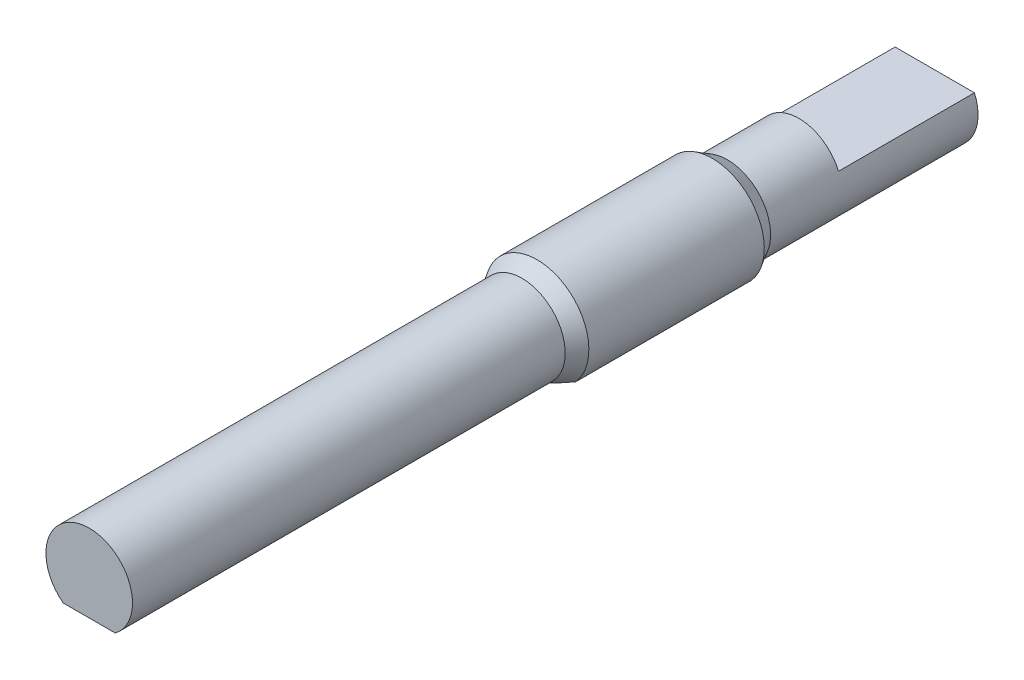
ISO-10303-21;
HEADER;
FILE_DESCRIPTION(('STEP AP214'),'2;1');
FILE_NAME('part.step','',(''),(''),'','','');
FILE_SCHEMA(('AUTOMOTIVE_DESIGN { 1 0 10303 214 1 1 1 1 }'));
ENDSEC;
DATA;
#1=APPLICATION_CONTEXT('core data for automotive mechanical design processes');
#2=APPLICATION_PROTOCOL_DEFINITION('international standard','automotive_design',2000,#1);
#3=PRODUCT_CONTEXT('',#1,'mechanical');
#4=PRODUCT('Part','Part','',(#3));
#5=PRODUCT_RELATED_PRODUCT_CATEGORY('part','',(#4));
#6=PRODUCT_DEFINITION_FORMATION('','',#4);
#7=PRODUCT_DEFINITION_CONTEXT('part definition',#1,'design');
#8=PRODUCT_DEFINITION('design','',#6,#7);
#9=PRODUCT_DEFINITION_SHAPE('','',#8);
#10=(LENGTH_UNIT() NAMED_UNIT(*) SI_UNIT(.MILLI.,.METRE.));
#11=(NAMED_UNIT(*) PLANE_ANGLE_UNIT() SI_UNIT($,.RADIAN.));
#12=(NAMED_UNIT(*) SI_UNIT($,.STERADIAN.) SOLID_ANGLE_UNIT());
#13=UNCERTAINTY_MEASURE_WITH_UNIT(LENGTH_MEASURE(1.E-05),#10,'distance_accuracy_value','');
#14=(GEOMETRIC_REPRESENTATION_CONTEXT(3) GLOBAL_UNCERTAINTY_ASSIGNED_CONTEXT((#13)) GLOBAL_UNIT_ASSIGNED_CONTEXT((#10,
#11,#12)) REPRESENTATION_CONTEXT('',''));
#15=CARTESIAN_POINT('',(0.,0.,0.));
#16=DIRECTION('',(0.,0.,1.));
#17=DIRECTION('',(1.,0.,0.));
#18=AXIS2_PLACEMENT_3D('',#15,#16,#17);
#19=CARTESIAN_POINT('',(0.,0.,25.));
#20=DIRECTION('',(0.,0.,-1.));
#21=DIRECTION('',(-1.,0.,0.));
#22=AXIS2_PLACEMENT_3D('',#19,#20,#21);
#23=CYLINDRICAL_SURFACE('',#22,2.5);
#24=CARTESIAN_POINT('',(0.,0.,25.));
#25=DIRECTION('',(0.,0.,1.));
#26=DIRECTION('',(1.,0.,0.));
#27=AXIS2_PLACEMENT_3D('',#24,#25,#26);
#28=CIRCLE('',#27,2.5);
#29=CARTESIAN_POINT('',(1.5,-2.,25.));
#30=VERTEX_POINT('',#29);
#31=CARTESIAN_POINT('',(-1.5,-2.,25.));
#32=VERTEX_POINT('',#31);
#33=EDGE_CURVE('E208',#30,#32,#28,.T.);
#34=ORIENTED_EDGE('',*,*,#33,.F.);
#35=DIRECTION('',(0.,0.,-1.));
#36=VECTOR('',#35,1.);
#37=CARTESIAN_POINT('',(1.5,-2.,25.));
#38=LINE('',#37,#36);
#39=CARTESIAN_POINT('',(1.5,-2.,0.));
#40=VERTEX_POINT('',#39);
#41=EDGE_CURVE('E218',#30,#40,#38,.T.);
#42=ORIENTED_EDGE('',*,*,#41,.T.);
#43=CARTESIAN_POINT('',(0.,0.,0.));
#44=DIRECTION('',(0.,0.,1.));
#45=DIRECTION('',(1.,0.,0.));
#46=AXIS2_PLACEMENT_3D('',#43,#44,#45);
#47=CIRCLE('',#46,2.5);
#48=CARTESIAN_POINT('',(-1.5,-2.,0.));
#49=VERTEX_POINT('',#48);
#50=EDGE_CURVE('E207',#40,#49,#47,.T.);
#51=ORIENTED_EDGE('',*,*,#50,.T.);
#52=DIRECTION('',(0.,0.,-1.));
#53=VECTOR('',#52,1.);
#54=CARTESIAN_POINT('',(-1.5,-2.,25.));
#55=LINE('',#54,#53);
#56=EDGE_CURVE('E63',#49,#32,#55,.F.);
#57=ORIENTED_EDGE('',*,*,#56,.T.);
#58=EDGE_LOOP('',(#34,#42,#51,#57));
#59=FACE_BOUND('',#58,.T.);
#60=ADVANCED_FACE('F40',(#59),#23,.T.);
#61=CARTESIAN_POINT('',(0.,0.,25.));
#62=DIRECTION('',(0.,0.,1.));
#63=DIRECTION('',(1.,0.,0.));
#64=AXIS2_PLACEMENT_3D('',#61,#62,#63);
#65=PLANE('',#64);
#66=DIRECTION('',(-1.,0.,0.));
#67=VECTOR('',#66,1.);
#68=CARTESIAN_POINT('',(0.,-2.,25.));
#69=LINE('',#68,#67);
#70=EDGE_CURVE('E56',#30,#32,#69,.T.);
#71=ORIENTED_EDGE('',*,*,#70,.F.);
#72=ORIENTED_EDGE('',*,*,#33,.T.);
#73=EDGE_LOOP('',(#71,#72));
#74=FACE_BOUND('',#73,.T.);
#75=ADVANCED_FACE('F171',(#74),#65,.T.);
#76=CARTESIAN_POINT('',(0.,0.,-11.));
#77=DIRECTION('',(0.,0.,1.));
#78=DIRECTION('',(1.,0.,0.));
#79=AXIS2_PLACEMENT_3D('',#76,#77,#78);
#80=CYLINDRICAL_SURFACE('',#79,3.);
#81=CARTESIAN_POINT('',(0.,0.,-11.));
#82=DIRECTION('',(0.,0.,-1.));
#83=DIRECTION('',(-1.,0.,0.));
#84=AXIS2_PLACEMENT_3D('',#81,#82,#83);
#85=CIRCLE('',#84,3.);
#86=CARTESIAN_POINT('',(-2.23606797749979,-2.,-11.));
#87=VERTEX_POINT('',#86);
#88=CARTESIAN_POINT('',(2.23606797749979,-2.,-11.));
#89=VERTEX_POINT('',#88);
#90=EDGE_CURVE('E204',#87,#89,#85,.T.);
#91=ORIENTED_EDGE('',*,*,#90,.F.);
#92=DIRECTION('',(0.,0.,1.));
#93=VECTOR('',#92,1.);
#94=CARTESIAN_POINT('',(-2.23606797749979,-2.,-11.));
#95=LINE('',#94,#93);
#96=CARTESIAN_POINT('',(-2.23606797749979,-2.,-0.866025403784439));
#97=VERTEX_POINT('',#96);
#98=EDGE_CURVE('E158',#87,#97,#95,.T.);
#99=ORIENTED_EDGE('',*,*,#98,.T.);
#100=CARTESIAN_POINT('',(0.,0.,-0.866025403784439));
#101=DIRECTION('',(0.,0.,-1.));
#102=DIRECTION('',(-1.,0.,0.));
#103=AXIS2_PLACEMENT_3D('',#100,#101,#102);
#104=CIRCLE('',#103,3.);
#105=CARTESIAN_POINT('',(2.23606797749979,-2.,-0.866025403784439));
#106=VERTEX_POINT('',#105);
#107=EDGE_CURVE('E210',#97,#106,#104,.T.);
#108=ORIENTED_EDGE('',*,*,#107,.T.);
#109=DIRECTION('',(0.,0.,1.));
#110=VECTOR('',#109,1.);
#111=CARTESIAN_POINT('',(2.23606797749979,-2.,-11.));
#112=LINE('',#111,#110);
#113=EDGE_CURVE('E142',#106,#89,#112,.F.);
#114=ORIENTED_EDGE('',*,*,#113,.T.);
#115=EDGE_LOOP('',(#91,#99,#108,#114));
#116=FACE_BOUND('',#115,.T.);
#117=ADVANCED_FACE('F167',(#116),#80,.T.);
#118=CARTESIAN_POINT('',(0.,0.,-0.866025403784439));
#119=DIRECTION('',(0.,0.,-1.));
#120=DIRECTION('',(-1.,0.,0.));
#121=AXIS2_PLACEMENT_3D('',#118,#119,#120);
#122=CONICAL_SURFACE('',#121,3.,0.523598775598297);
#123=CARTESIAN_POINT('',(2.23661016595739,-2.,-0.866725403784439));
#124=CARTESIAN_POINT('',(2.18726664014089,-2.,-0.803033071174665));
#125=CARTESIAN_POINT('',(2.13748259507712,-2.,-0.739676346682983));
#126=CARTESIAN_POINT('',(2.03683184790524,-2.,-0.613795352713225));
#127=CARTESIAN_POINT('',(1.98596479297575,-2.,-0.551271365649455));
#128=CARTESIAN_POINT('',(1.88228724074045,-2.,-0.426426706496489));
#129=CARTESIAN_POINT('',(1.82945981731535,-2.,-0.364120043102219));
#130=CARTESIAN_POINT('',(1.72227192526655,-2.,-0.24085096266649));
#131=CARTESIAN_POINT('',(1.66791167428164,-2.,-0.179888356957202));
#132=CARTESIAN_POINT('',(1.55335778674456,-2.,-0.0553452759837598));
#133=CARTESIAN_POINT('',(1.49302567658785,-2.,0.00810850221818952));
#134=CARTESIAN_POINT('',(1.36972792075992,-2.,0.132399385515604));
#135=CARTESIAN_POINT('',(1.30676282508385,-2.,0.193237031753401));
#136=CARTESIAN_POINT('',(1.17788872353185,-2.,0.311008191068564));
#137=CARTESIAN_POINT('',(1.11199770678652,-2.,0.36796124119291));
#138=CARTESIAN_POINT('',(0.976199242747053,-2.,0.476814597641537));
#139=CARTESIAN_POINT('',(0.906296448556987,-2.,0.528720576774447));
#140=CARTESIAN_POINT('',(0.799940004250271,-2.,0.599606925092459));
#141=CARTESIAN_POINT('',(0.765399801139247,-2.,0.621454325880099));
#142=CARTESIAN_POINT('',(0.695145832543396,-2.,0.663192577265789));
#143=CARTESIAN_POINT('',(0.659431650775473,-2.,0.683082723632428));
#144=CARTESIAN_POINT('',(0.550936362503915,-2.,0.738975543798395));
#145=CARTESIAN_POINT('',(0.476293869608862,-2.,0.771552011378186));
#146=CARTESIAN_POINT('',(0.333968670143521,-2.,0.819813770183789));
#147=CARTESIAN_POINT('',(0.266908219474679,-2.,0.837293614487771));
#148=CARTESIAN_POINT('',(0.130773906542163,-2.,0.860600687840221));
#149=CARTESIAN_POINT('',(0.061702213260861,-2.,0.866440030200273));
#150=CARTESIAN_POINT('',(-0.0764939692106354,-2.,0.865563411175417));
#151=CARTESIAN_POINT('',(-0.14561830035995,-2.,0.858823040930376));
#152=CARTESIAN_POINT('',(-0.281716005411692,-2.,0.83380272817737));
#153=CARTESIAN_POINT('',(-0.348687086085616,-2.,0.815510884906201));
#154=CARTESIAN_POINT('',(-0.510669248764108,-2.,0.758657980617055));
#155=CARTESIAN_POINT('',(-0.603714349109279,-2.,0.714582506458467));
#156=CARTESIAN_POINT('',(-0.737868578718455,-2.,0.638527663157651));
#157=CARTESIAN_POINT('',(-0.781913239193631,-2.,0.611340207373083));
#158=CARTESIAN_POINT('',(-0.868245506414882,-2.,0.554310997854809));
#159=CARTESIAN_POINT('',(-0.91053375229659,-2.,0.524470222265757));
#160=CARTESIAN_POINT('',(-1.0168179117519,-2.,0.445354455641794));
#161=CARTESIAN_POINT('',(-1.07968100681679,-2.,0.394569382325353));
#162=CARTESIAN_POINT('',(-1.20228613968727,-2.,0.289336984676686));
#163=CARTESIAN_POINT('',(-1.26202623193758,-2.,0.23488742464741));
#164=CARTESIAN_POINT('',(-1.3791373698903,-2.,0.123123816195552));
#165=CARTESIAN_POINT('',(-1.43649962401801,-2.,0.065800616439067));
#166=CARTESIAN_POINT('',(-1.54912012559803,-2.,-0.0508791842052778));
#167=CARTESIAN_POINT('',(-1.60437810028153,-2.,-0.110236046826562));
#168=CARTESIAN_POINT('',(-1.70957267620015,-2.,-0.226553079322438));
#169=CARTESIAN_POINT('',(-1.75962002274053,-2.,-0.283413531016207));
#170=CARTESIAN_POINT('',(-1.85844294656092,-2.,-0.39823475061407));
#171=CARTESIAN_POINT('',(-1.90721841636146,-2.,-0.456195610797169));
#172=CARTESIAN_POINT('',(-2.00328289737179,-2.,-0.572516314441755));
#173=CARTESIAN_POINT('',(-2.05058095900981,-2.,-0.630868704832463));
#174=CARTESIAN_POINT('',(-2.14425068995618,-2.,-0.748291466091099));
#175=CARTESIAN_POINT('',(-2.19062256602914,-2.,-0.807361671866581));
#176=CARTESIAN_POINT('',(-2.23661016595739,-2.,-0.866725403784438));
#177=B_SPLINE_CURVE_WITH_KNOTS('',3,(#123,#124,#125,#126,#127,#128,#129,#130,#131,#132,#133,
#134,#135,#136,#137,#138,#139,#140,#141,#142,#143,#144,#145,#146,#147,#148,#149,#150,#151,#152,
#153,#154,#155,#156,#157,#158,#159,#160,#161,#162,#163,#164,#165,#166,#167,#168,#169,#170,#171,
#172,#173,#174,#175,#176),.UNSPECIFIED.,.F.,.F.,(4,2,2,2,2,2,2,2,2,2,2,2,2,2,2,2,2,2,2,2,2,2,2,
2,2,2,4),(0.,0.241714228825522,0.483508445785132,0.728550092917328,0.97355712124028,
1.23617094608527,1.49873018582213,1.75985308417518,2.02067900803402,2.14322999413358,
2.26582491477964,2.50917120104289,2.71622506224583,2.92306334683918,3.13030338436133,
3.33775727747857,3.64476067885647,3.79999330392009,3.95516893797713,4.19740907992852,
4.43979837593437,4.68301583098036,4.92626470669405,5.15348865307162,5.38073173910076,
5.60606401515084,5.8313454119841),.UNSPECIFIED.);
#178=EDGE_CURVE('E157',#106,#40,#177,.T.);
#179=ORIENTED_EDGE('',*,*,#178,.F.);
#180=ORIENTED_EDGE('',*,*,#107,.F.);
#181=EDGE_CURVE('E150',#49,#97,#177,.T.);
#182=ORIENTED_EDGE('',*,*,#181,.F.);
#183=ORIENTED_EDGE('',*,*,#50,.F.);
#184=EDGE_LOOP('',(#179,#180,#182,#183));
#185=FACE_BOUND('',#184,.T.);
#186=ADVANCED_FACE('F161',(#185),#122,.T.);
#187=CARTESIAN_POINT('',(0.,0.,-16.));
#188=DIRECTION('',(0.,0.,1.));
#189=DIRECTION('',(1.,0.,0.));
#190=AXIS2_PLACEMENT_3D('',#187,#188,#189);
#191=CYLINDRICAL_SURFACE('',#190,2.5);
#192=CARTESIAN_POINT('',(0.,0.,-23.85));
#193=DIRECTION('',(0.,0.,-1.));
#194=DIRECTION('',(-1.,0.,0.));
#195=AXIS2_PLACEMENT_3D('',#192,#193,#194);
#196=CIRCLE('',#195,2.5);
#197=CARTESIAN_POINT('',(-1.5,-2.,-23.85));
#198=VERTEX_POINT('',#197);
#199=CARTESIAN_POINT('',(-2.29128784747792,1.,-23.85));
#200=VERTEX_POINT('',#199);
#201=EDGE_CURVE('E116',#198,#200,#196,.T.);
#202=ORIENTED_EDGE('',*,*,#201,.F.);
#203=DIRECTION('',(0.,0.,1.));
#204=VECTOR('',#203,1.);
#205=CARTESIAN_POINT('',(-1.5,-2.,-16.));
#206=LINE('',#205,#204);
#207=CARTESIAN_POINT('',(-1.5,-2.,-11.8660254037844));
#208=VERTEX_POINT('',#207);
#209=EDGE_CURVE('E125',#198,#208,#206,.T.);
#210=ORIENTED_EDGE('',*,*,#209,.T.);
#211=CARTESIAN_POINT('',(0.,0.,-11.8660254037844));
#212=DIRECTION('',(0.,0.,-1.));
#213=DIRECTION('',(-1.,0.,0.));
#214=AXIS2_PLACEMENT_3D('',#211,#212,#213);
#215=CIRCLE('',#214,2.5);
#216=CARTESIAN_POINT('',(1.5,-2.,-11.8660254037844));
#217=VERTEX_POINT('',#216);
#218=EDGE_CURVE('E50',#208,#217,#215,.T.);
#219=ORIENTED_EDGE('',*,*,#218,.T.);
#220=DIRECTION('',(0.,0.,1.));
#221=VECTOR('',#220,1.);
#222=CARTESIAN_POINT('',(1.5,-2.,-16.));
#223=LINE('',#222,#221);
#224=CARTESIAN_POINT('',(1.5,-2.,-23.85));
#225=VERTEX_POINT('',#224);
#226=EDGE_CURVE('E120',#217,#225,#223,.F.);
#227=ORIENTED_EDGE('',*,*,#226,.T.);
#228=CARTESIAN_POINT('',(2.29128784747792,1.,-23.85));
#229=VERTEX_POINT('',#228);
#230=EDGE_CURVE('E107',#229,#225,#196,.T.);
#231=ORIENTED_EDGE('',*,*,#230,.F.);
#232=DIRECTION('',(0.,0.,1.));
#233=VECTOR('',#232,1.);
#234=CARTESIAN_POINT('',(2.29128784747792,1.,-23.85));
#235=LINE('',#234,#233);
#236=CARTESIAN_POINT('',(2.29128784747792,1.,-16.));
#237=VERTEX_POINT('',#236);
#238=EDGE_CURVE('E193',#229,#237,#235,.T.);
#239=ORIENTED_EDGE('',*,*,#238,.T.);
#240=CARTESIAN_POINT('',(0.,0.,-16.));
#241=DIRECTION('',(0.,0.,-1.));
#242=DIRECTION('',(-1.,0.,0.));
#243=AXIS2_PLACEMENT_3D('',#240,#241,#242);
#244=CIRCLE('',#243,2.5);
#245=CARTESIAN_POINT('',(-2.29128784747792,1.,-16.));
#246=VERTEX_POINT('',#245);
#247=EDGE_CURVE('E198',#246,#237,#244,.T.);
#248=ORIENTED_EDGE('',*,*,#247,.F.);
#249=DIRECTION('',(0.,0.,1.));
#250=VECTOR('',#249,1.);
#251=CARTESIAN_POINT('',(-2.29128784747792,1.,-23.85));
#252=LINE('',#251,#250);
#253=EDGE_CURVE('E195',#200,#246,#252,.T.);
#254=ORIENTED_EDGE('',*,*,#253,.F.);
#255=EDGE_LOOP('',(#202,#210,#219,#227,#231,#239,#248,#254));
#256=FACE_BOUND('',#255,.T.);
#257=ADVANCED_FACE('F121',(#256),#191,.T.);
#258=CARTESIAN_POINT('',(0.,0.,-16.));
#259=DIRECTION('',(0.,0.,-1.));
#260=DIRECTION('',(-1.,0.,0.));
#261=AXIS2_PLACEMENT_3D('',#258,#259,#260);
#262=PLANE('',#261);
#263=DIRECTION('',(1.,0.,0.));
#264=VECTOR('',#263,1.);
#265=CARTESIAN_POINT('',(2.29128784747792,1.,-16.));
#266=LINE('',#265,#264);
#267=EDGE_CURVE('E192',#246,#237,#266,.T.);
#268=ORIENTED_EDGE('',*,*,#267,.F.);
#269=ORIENTED_EDGE('',*,*,#247,.T.);
#270=EDGE_LOOP('',(#268,#269));
#271=FACE_BOUND('',#270,.T.);
#272=ADVANCED_FACE('F179',(#271),#262,.T.);
#273=CARTESIAN_POINT('',(0.,0.,-11.8660254037844));
#274=DIRECTION('',(0.,0.,1.));
#275=DIRECTION('',(1.,0.,0.));
#276=AXIS2_PLACEMENT_3D('',#273,#274,#275);
#277=CONICAL_SURFACE('',#276,2.5,0.523598775598294);
#278=ORIENTED_EDGE('',*,*,#90,.T.);
#279=CARTESIAN_POINT('',(2.23661016595739,-2.,-10.9993));
#280=CARTESIAN_POINT('',(2.18726664014089,-2.,-11.0629923326098));
#281=CARTESIAN_POINT('',(2.13748259507712,-2.,-11.1263490571015));
#282=CARTESIAN_POINT('',(2.03683184790524,-2.,-11.2522300510712));
#283=CARTESIAN_POINT('',(1.98596479297575,-2.,-11.314754038135));
#284=CARTESIAN_POINT('',(1.88228724074045,-2.,-11.4395986972879));
#285=CARTESIAN_POINT('',(1.82945981731535,-2.,-11.5019053606822));
#286=CARTESIAN_POINT('',(1.72227192526655,-2.,-11.6251744411179));
#287=CARTESIAN_POINT('',(1.66791167428164,-2.,-11.6861370468272));
#288=CARTESIAN_POINT('',(1.55335778674456,-2.,-11.8106801278007));
#289=CARTESIAN_POINT('',(1.49302567658785,-2.,-11.8741339060026));
#290=CARTESIAN_POINT('',(1.36972792075992,-2.,-11.9984247893));
#291=CARTESIAN_POINT('',(1.30676282508385,-2.,-12.0592624355378));
#292=CARTESIAN_POINT('',(1.17788872353185,-2.,-12.177033594853));
#293=CARTESIAN_POINT('',(1.11199770678652,-2.,-12.2339866449774));
#294=CARTESIAN_POINT('',(0.976199242747056,-2.,-12.342840001426));
#295=CARTESIAN_POINT('',(0.90629644855699,-2.,-12.3947459805589));
#296=CARTESIAN_POINT('',(0.799940004250274,-2.,-12.4656323288769));
#297=CARTESIAN_POINT('',(0.765399801139251,-2.,-12.4874797296645));
#298=CARTESIAN_POINT('',(0.6951458325434,-2.,-12.5292179810502));
#299=CARTESIAN_POINT('',(0.659431650775478,-2.,-12.5491081274169));
#300=CARTESIAN_POINT('',(0.550936362503921,-2.,-12.6050009475828));
#301=CARTESIAN_POINT('',(0.476293869608867,-2.,-12.6375774151626));
#302=CARTESIAN_POINT('',(0.333968670143527,-2.,-12.6858391739682));
#303=CARTESIAN_POINT('',(0.266908219474685,-2.,-12.7033190182722));
#304=CARTESIAN_POINT('',(0.13077390654217,-2.,-12.7266260916247));
#305=CARTESIAN_POINT('',(0.0617022132608684,-2.,-12.7324654339847));
#306=CARTESIAN_POINT('',(-0.0764939692106276,-2.,-12.7315888149599));
#307=CARTESIAN_POINT('',(-0.145618300359942,-2.,-12.7248484447148));
#308=CARTESIAN_POINT('',(-0.281716005411684,-2.,-12.6998281319618));
#309=CARTESIAN_POINT('',(-0.348687086085608,-2.,-12.6815362886907));
#310=CARTESIAN_POINT('',(-0.5106692487641,-2.,-12.6246833844015));
#311=CARTESIAN_POINT('',(-0.60371434910927,-2.,-12.5806079102429));
#312=CARTESIAN_POINT('',(-0.737868578718444,-2.,-12.5045530669421));
#313=CARTESIAN_POINT('',(-0.781913239193619,-2.,-12.4773656111575));
#314=CARTESIAN_POINT('',(-0.868245506414868,-2.,-12.4203364016393));
#315=CARTESIAN_POINT('',(-0.910533752296576,-2.,-12.3904956260502));
#316=CARTESIAN_POINT('',(-1.01681791175189,-2.,-12.3113798594262));
#317=CARTESIAN_POINT('',(-1.07968100681678,-2.,-12.2605947861098));
#318=CARTESIAN_POINT('',(-1.20228613968726,-2.,-12.1553623884611));
#319=CARTESIAN_POINT('',(-1.26202623193757,-2.,-12.1009128284319));
#320=CARTESIAN_POINT('',(-1.37913736989029,-2.,-11.98914921998));
#321=CARTESIAN_POINT('',(-1.436499624018,-2.,-11.9318260202235));
#322=CARTESIAN_POINT('',(-1.54912012559802,-2.,-11.8151462195792));
#323=CARTESIAN_POINT('',(-1.60437810028152,-2.,-11.7557893569579));
#324=CARTESIAN_POINT('',(-1.70957267620015,-2.,-11.639472324462));
#325=CARTESIAN_POINT('',(-1.75962002274053,-2.,-11.5826118727682));
#326=CARTESIAN_POINT('',(-1.85844294656091,-2.,-11.4677906531704));
#327=CARTESIAN_POINT('',(-1.90721841636146,-2.,-11.4098297929873));
#328=CARTESIAN_POINT('',(-2.00328289737179,-2.,-11.2935090893427));
#329=CARTESIAN_POINT('',(-2.05058095900981,-2.,-11.235156698952));
#330=CARTESIAN_POINT('',(-2.14425068995618,-2.,-11.1177339376933));
#331=CARTESIAN_POINT('',(-2.19062256602914,-2.,-11.0586637319179));
#332=CARTESIAN_POINT('',(-2.23661016595739,-2.,-10.9993));
#333=B_SPLINE_CURVE_WITH_KNOTS('',3,(#279,#280,#281,#282,#283,#284,#285,#286,#287,#288,#289,
#290,#291,#292,#293,#294,#295,#296,#297,#298,#299,#300,#301,#302,#303,#304,#305,#306,#307,#308,
#309,#310,#311,#312,#313,#314,#315,#316,#317,#318,#319,#320,#321,#322,#323,#324,#325,#326,#327,
#328,#329,#330,#331,#332),.UNSPECIFIED.,.F.,.F.,(4,2,2,2,2,2,2,2,2,2,2,2,2,2,2,2,2,2,2,2,2,2,2,
2,2,2,4),(0.,0.241714228825522,0.483508445785131,0.728550092917327,0.973557121240281,
1.23617094608527,1.49873018582213,1.75985308417519,2.02067900803403,2.14322999413358,
2.26582491477964,2.50917120104289,2.71622506224583,2.92306334683918,3.13030338436133,
3.33775727747857,3.64476067885647,3.79999330392008,3.95516893797712,4.19740907992851,
4.43979837593437,4.68301583098036,4.92626470669406,5.15348865307163,5.38073173910077,
5.60606401515085,5.83134541198411),.UNSPECIFIED.);
#334=EDGE_CURVE('E134',#89,#217,#333,.T.);
#335=ORIENTED_EDGE('',*,*,#334,.T.);
#336=ORIENTED_EDGE('',*,*,#218,.F.);
#337=EDGE_CURVE('E132',#208,#87,#333,.T.);
#338=ORIENTED_EDGE('',*,*,#337,.T.);
#339=EDGE_LOOP('',(#278,#335,#336,#338));
#340=FACE_BOUND('',#339,.T.);
#341=ADVANCED_FACE('F43',(#340),#277,.T.);
#342=CARTESIAN_POINT('',(2.29128784747792,1.,-23.85));
#343=DIRECTION('',(0.,-1.,0.));
#344=DIRECTION('',(0.,0.,-1.));
#345=AXIS2_PLACEMENT_3D('',#342,#343,#344);
#346=PLANE('',#345);
#347=ORIENTED_EDGE('',*,*,#267,.T.);
#348=ORIENTED_EDGE('',*,*,#238,.F.);
#349=DIRECTION('',(1.,0.,0.));
#350=VECTOR('',#349,1.);
#351=CARTESIAN_POINT('',(2.29128784747792,1.,-23.85));
#352=LINE('',#351,#350);
#353=EDGE_CURVE('E112',#200,#229,#352,.T.);
#354=ORIENTED_EDGE('',*,*,#353,.F.);
#355=ORIENTED_EDGE('',*,*,#253,.T.);
#356=EDGE_LOOP('',(#347,#348,#354,#355));
#357=FACE_BOUND('',#356,.T.);
#358=ADVANCED_FACE('F182',(#357),#346,.F.);
#359=CARTESIAN_POINT('',(0.,0.,-23.85));
#360=DIRECTION('',(0.,0.,-1.));
#361=DIRECTION('',(-1.,0.,0.));
#362=AXIS2_PLACEMENT_3D('',#359,#360,#361);
#363=PLANE('',#362);
#364=DIRECTION('',(1.,0.,0.));
#365=VECTOR('',#364,1.);
#366=CARTESIAN_POINT('',(0.,-2.,-23.85));
#367=LINE('',#366,#365);
#368=EDGE_CURVE('E12',#198,#225,#367,.T.);
#369=ORIENTED_EDGE('',*,*,#368,.F.);
#370=ORIENTED_EDGE('',*,*,#201,.T.);
#371=ORIENTED_EDGE('',*,*,#353,.T.);
#372=ORIENTED_EDGE('',*,*,#230,.T.);
#373=EDGE_LOOP('',(#369,#370,#371,#372));
#374=FACE_BOUND('',#373,.T.);
#375=ADVANCED_FACE('F109',(#374),#363,.T.);
#376=CARTESIAN_POINT('',(0.,-2.,0.));
#377=DIRECTION('',(0.,1.,0.));
#378=DIRECTION('',(0.,0.,1.));
#379=AXIS2_PLACEMENT_3D('',#376,#377,#378);
#380=PLANE('',#379);
#381=ORIENTED_EDGE('',*,*,#41,.F.);
#382=ORIENTED_EDGE('',*,*,#70,.T.);
#383=ORIENTED_EDGE('',*,*,#56,.F.);
#384=ORIENTED_EDGE('',*,*,#181,.T.);
#385=ORIENTED_EDGE('',*,*,#98,.F.);
#386=ORIENTED_EDGE('',*,*,#337,.F.);
#387=ORIENTED_EDGE('',*,*,#209,.F.);
#388=ORIENTED_EDGE('',*,*,#368,.T.);
#389=ORIENTED_EDGE('',*,*,#226,.F.);
#390=ORIENTED_EDGE('',*,*,#334,.F.);
#391=ORIENTED_EDGE('',*,*,#113,.F.);
#392=ORIENTED_EDGE('',*,*,#178,.T.);
#393=EDGE_LOOP('',(#381,#382,#383,#384,#385,#386,#387,#388,#389,#390,#391,#392));
#394=FACE_BOUND('',#393,.T.);
#395=ADVANCED_FACE('F129',(#394),#380,.F.);
#396=CLOSED_SHELL('',(#60,#75,#117,#186,#257,#272,#341,#358,#375,#395));
#397=MANIFOLD_SOLID_BREP('B2',#396);
#398=ADVANCED_BREP_SHAPE_REPRESENTATION('',(#18,#397),#14);
#399=SHAPE_DEFINITION_REPRESENTATION(#9,#398);
ENDSEC;
END-ISO-10303-21;
